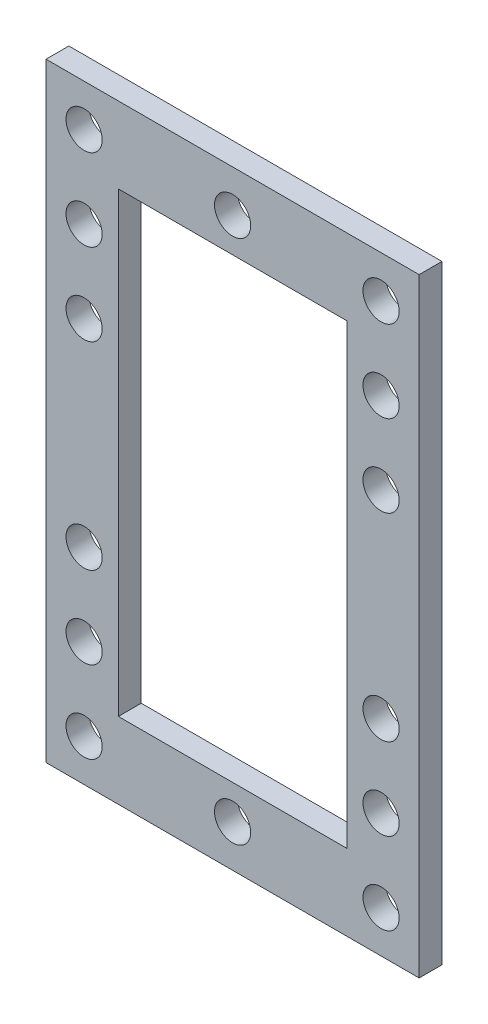
ISO-10303-21;
HEADER;
FILE_DESCRIPTION(('STEP AP214'),'2;1');
FILE_NAME('part.step','',(''),(''),'','','');
FILE_SCHEMA(('AUTOMOTIVE_DESIGN { 1 0 10303 214 1 1 1 1 }'));
ENDSEC;
DATA;
#1=APPLICATION_CONTEXT('core data for automotive mechanical design processes');
#2=APPLICATION_PROTOCOL_DEFINITION('international standard','automotive_design',2000,#1);
#3=PRODUCT_CONTEXT('',#1,'mechanical');
#4=PRODUCT('Part','Part','',(#3));
#5=PRODUCT_RELATED_PRODUCT_CATEGORY('part','',(#4));
#6=PRODUCT_DEFINITION_FORMATION('','',#4);
#7=PRODUCT_DEFINITION_CONTEXT('part definition',#1,'design');
#8=PRODUCT_DEFINITION('design','',#6,#7);
#9=PRODUCT_DEFINITION_SHAPE('','',#8);
#10=(LENGTH_UNIT() NAMED_UNIT(*) SI_UNIT(.MILLI.,.METRE.));
#11=(NAMED_UNIT(*) PLANE_ANGLE_UNIT() SI_UNIT($,.RADIAN.));
#12=(NAMED_UNIT(*) SI_UNIT($,.STERADIAN.) SOLID_ANGLE_UNIT());
#13=UNCERTAINTY_MEASURE_WITH_UNIT(LENGTH_MEASURE(1.E-05),#10,'distance_accuracy_value','');
#14=(GEOMETRIC_REPRESENTATION_CONTEXT(3) GLOBAL_UNCERTAINTY_ASSIGNED_CONTEXT((#13)) GLOBAL_UNIT_ASSIGNED_CONTEXT((#10,
#11,#12)) REPRESENTATION_CONTEXT('',''));
#15=CARTESIAN_POINT('',(0.,0.,0.));
#16=DIRECTION('',(0.,0.,1.));
#17=DIRECTION('',(1.,0.,0.));
#18=AXIS2_PLACEMENT_3D('',#15,#16,#17);
#19=CARTESIAN_POINT('',(0.,0.,-1.2));
#20=DIRECTION('',(0.,0.,-1.));
#21=DIRECTION('',(-1.,0.,0.));
#22=AXIS2_PLACEMENT_3D('',#19,#20,#21);
#23=PLANE('',#22);
#24=CARTESIAN_POINT('',(-7.80000000000001,9.5,-1.2));
#25=DIRECTION('',(0.,0.,1.));
#26=DIRECTION('',(-1.,0.,0.));
#27=AXIS2_PLACEMENT_3D('',#24,#25,#26);
#28=CIRCLE('',#27,0.949999999999999);
#29=CARTESIAN_POINT('',(-8.75000000000001,9.5,-1.2));
#30=VERTEX_POINT('',#29);
#31=EDGE_CURVE('E212',#30,#30,#28,.T.);
#32=ORIENTED_EDGE('',*,*,#31,.T.);
#33=EDGE_LOOP('',(#32));
#34=FACE_BOUND('',#33,.T.);
#35=CARTESIAN_POINT('',(7.80000000000001,-5.2,-1.2));
#36=DIRECTION('',(0.,0.,1.));
#37=DIRECTION('',(1.,0.,0.));
#38=AXIS2_PLACEMENT_3D('',#35,#36,#37);
#39=CIRCLE('',#38,0.949999999999999);
#40=CARTESIAN_POINT('',(8.75000000000001,-5.2,-1.2));
#41=VERTEX_POINT('',#40);
#42=EDGE_CURVE('E235',#41,#41,#39,.T.);
#43=ORIENTED_EDGE('',*,*,#42,.T.);
#44=EDGE_LOOP('',(#43));
#45=FACE_BOUND('',#44,.T.);
#46=CARTESIAN_POINT('',(7.80000000000001,-13.8,-1.2));
#47=DIRECTION('',(0.,0.,1.));
#48=DIRECTION('',(1.,0.,0.));
#49=AXIS2_PLACEMENT_3D('',#46,#47,#48);
#50=CIRCLE('',#49,0.949999999999999);
#51=CARTESIAN_POINT('',(8.75000000000001,-13.8,-1.2));
#52=VERTEX_POINT('',#51);
#53=EDGE_CURVE('E245',#52,#52,#50,.T.);
#54=ORIENTED_EDGE('',*,*,#53,.T.);
#55=EDGE_LOOP('',(#54));
#56=FACE_BOUND('',#55,.T.);
#57=CARTESIAN_POINT('',(-7.80000000000001,-9.5,-1.2));
#58=DIRECTION('',(0.,0.,-1.));
#59=DIRECTION('',(-1.,0.,0.));
#60=AXIS2_PLACEMENT_3D('',#57,#58,#59);
#61=CIRCLE('',#60,0.949999999999999);
#62=CARTESIAN_POINT('',(-8.75000000000001,-9.5,-1.2));
#63=VERTEX_POINT('',#62);
#64=EDGE_CURVE('E255',#63,#63,#61,.T.);
#65=ORIENTED_EDGE('',*,*,#64,.F.);
#66=EDGE_LOOP('',(#65));
#67=FACE_BOUND('',#66,.T.);
#68=CARTESIAN_POINT('',(-7.80000000000001,-13.8,-1.2));
#69=DIRECTION('',(0.,0.,-1.));
#70=DIRECTION('',(-1.,0.,0.));
#71=AXIS2_PLACEMENT_3D('',#68,#69,#70);
#72=CIRCLE('',#71,0.949999999999999);
#73=CARTESIAN_POINT('',(-8.75000000000001,-13.8,-1.2));
#74=VERTEX_POINT('',#73);
#75=EDGE_CURVE('E258',#74,#74,#72,.T.);
#76=ORIENTED_EDGE('',*,*,#75,.F.);
#77=EDGE_LOOP('',(#76));
#78=FACE_BOUND('',#77,.T.);
#79=CARTESIAN_POINT('',(0.,-13.8,-1.2));
#80=DIRECTION('',(0.,0.,-1.));
#81=DIRECTION('',(-1.,0.,0.));
#82=AXIS2_PLACEMENT_3D('',#79,#80,#81);
#83=CIRCLE('',#82,0.949999999999999);
#84=CARTESIAN_POINT('',(-0.949999999999999,-13.8,-1.2));
#85=VERTEX_POINT('',#84);
#86=EDGE_CURVE('E262',#85,#85,#83,.T.);
#87=ORIENTED_EDGE('',*,*,#86,.F.);
#88=EDGE_LOOP('',(#87));
#89=FACE_BOUND('',#88,.T.);
#90=CARTESIAN_POINT('',(0.,13.8,-1.2));
#91=DIRECTION('',(0.,0.,-1.));
#92=DIRECTION('',(-1.,0.,0.));
#93=AXIS2_PLACEMENT_3D('',#90,#91,#92);
#94=CIRCLE('',#93,0.95);
#95=CARTESIAN_POINT('',(-0.95,13.8,-1.2));
#96=VERTEX_POINT('',#95);
#97=EDGE_CURVE('E122',#96,#96,#94,.T.);
#98=ORIENTED_EDGE('',*,*,#97,.F.);
#99=EDGE_LOOP('',(#98));
#100=FACE_BOUND('',#99,.T.);
#101=DIRECTION('',(0.,1.,0.));
#102=VECTOR('',#101,1.);
#103=CARTESIAN_POINT('',(6.,-12.,-1.2));
#104=LINE('',#103,#102);
#105=CARTESIAN_POINT('',(6.,-12.,-1.2));
#106=VERTEX_POINT('',#105);
#107=CARTESIAN_POINT('',(6.,12.,-1.2));
#108=VERTEX_POINT('',#107);
#109=EDGE_CURVE('E101',#106,#108,#104,.T.);
#110=ORIENTED_EDGE('',*,*,#109,.T.);
#111=DIRECTION('',(-1.,0.,0.));
#112=VECTOR('',#111,1.);
#113=CARTESIAN_POINT('',(-6.,12.,-1.2));
#114=LINE('',#113,#112);
#115=CARTESIAN_POINT('',(-6.,12.,-1.2));
#116=VERTEX_POINT('',#115);
#117=EDGE_CURVE('E110',#108,#116,#114,.T.);
#118=ORIENTED_EDGE('',*,*,#117,.T.);
#119=DIRECTION('',(0.,-1.,0.));
#120=VECTOR('',#119,1.);
#121=CARTESIAN_POINT('',(-6.,-12.,-1.2));
#122=LINE('',#121,#120);
#123=CARTESIAN_POINT('',(-6.,-12.,-1.2));
#124=VERTEX_POINT('',#123);
#125=EDGE_CURVE('E49',#116,#124,#122,.T.);
#126=ORIENTED_EDGE('',*,*,#125,.T.);
#127=DIRECTION('',(1.,0.,0.));
#128=VECTOR('',#127,1.);
#129=CARTESIAN_POINT('',(-6.,-12.,-1.2));
#130=LINE('',#129,#128);
#131=EDGE_CURVE('E107',#124,#106,#130,.T.);
#132=ORIENTED_EDGE('',*,*,#131,.T.);
#133=EDGE_LOOP('',(#110,#118,#126,#132));
#134=FACE_BOUND('',#133,.T.);
#135=DIRECTION('',(0.,1.,0.));
#136=VECTOR('',#135,1.);
#137=CARTESIAN_POINT('',(9.8,-16.,-1.2));
#138=LINE('',#137,#136);
#139=CARTESIAN_POINT('',(9.8,-16.,-1.2));
#140=VERTEX_POINT('',#139);
#141=CARTESIAN_POINT('',(9.8,16.,-1.2));
#142=VERTEX_POINT('',#141);
#143=EDGE_CURVE('E139',#140,#142,#138,.T.);
#144=ORIENTED_EDGE('',*,*,#143,.F.);
#145=DIRECTION('',(1.,0.,0.));
#146=VECTOR('',#145,1.);
#147=CARTESIAN_POINT('',(-9.80000000000001,-16.,-1.2));
#148=LINE('',#147,#146);
#149=CARTESIAN_POINT('',(-9.80000000000001,-16.,-1.2));
#150=VERTEX_POINT('',#149);
#151=EDGE_CURVE('E149',#150,#140,#148,.T.);
#152=ORIENTED_EDGE('',*,*,#151,.F.);
#153=DIRECTION('',(0.,-1.,0.));
#154=VECTOR('',#153,1.);
#155=CARTESIAN_POINT('',(-9.80000000000001,-16.,-1.2));
#156=LINE('',#155,#154);
#157=CARTESIAN_POINT('',(-9.80000000000001,16.,-1.2));
#158=VERTEX_POINT('',#157);
#159=EDGE_CURVE('E146',#158,#150,#156,.T.);
#160=ORIENTED_EDGE('',*,*,#159,.F.);
#161=DIRECTION('',(-1.,0.,0.));
#162=VECTOR('',#161,1.);
#163=CARTESIAN_POINT('',(-9.80000000000001,16.,-1.2));
#164=LINE('',#163,#162);
#165=EDGE_CURVE('E142',#142,#158,#164,.T.);
#166=ORIENTED_EDGE('',*,*,#165,.F.);
#167=EDGE_LOOP('',(#144,#152,#160,#166));
#168=FACE_BOUND('',#167,.T.);
#169=CARTESIAN_POINT('',(-7.80000000000001,-5.2,-1.2));
#170=DIRECTION('',(0.,0.,-1.));
#171=DIRECTION('',(-1.,0.,0.));
#172=AXIS2_PLACEMENT_3D('',#169,#170,#171);
#173=CIRCLE('',#172,0.949999999999999);
#174=CARTESIAN_POINT('',(-8.75000000000001,-5.2,-1.2));
#175=VERTEX_POINT('',#174);
#176=EDGE_CURVE('E11',#175,#175,#173,.T.);
#177=ORIENTED_EDGE('',*,*,#176,.F.);
#178=EDGE_LOOP('',(#177));
#179=FACE_BOUND('',#178,.T.);
#180=CARTESIAN_POINT('',(7.80000000000001,-9.5,-1.2));
#181=DIRECTION('',(0.,0.,1.));
#182=DIRECTION('',(1.,0.,0.));
#183=AXIS2_PLACEMENT_3D('',#180,#181,#182);
#184=CIRCLE('',#183,0.949999999999999);
#185=CARTESIAN_POINT('',(8.75000000000001,-9.5,-1.2));
#186=VERTEX_POINT('',#185);
#187=EDGE_CURVE('E188',#186,#186,#184,.T.);
#188=ORIENTED_EDGE('',*,*,#187,.T.);
#189=EDGE_LOOP('',(#188));
#190=FACE_BOUND('',#189,.T.);
#191=CARTESIAN_POINT('',(7.80000000000001,13.8,-1.2));
#192=DIRECTION('',(0.,0.,-1.));
#193=DIRECTION('',(1.,0.,0.));
#194=AXIS2_PLACEMENT_3D('',#191,#192,#193);
#195=CIRCLE('',#194,0.949999999999999);
#196=CARTESIAN_POINT('',(8.75000000000001,13.8,-1.2));
#197=VERTEX_POINT('',#196);
#198=EDGE_CURVE('E192',#197,#197,#195,.T.);
#199=ORIENTED_EDGE('',*,*,#198,.F.);
#200=EDGE_LOOP('',(#199));
#201=FACE_BOUND('',#200,.T.);
#202=CARTESIAN_POINT('',(7.80000000000001,9.5,-1.2));
#203=DIRECTION('',(0.,0.,-1.));
#204=DIRECTION('',(1.,0.,0.));
#205=AXIS2_PLACEMENT_3D('',#202,#203,#204);
#206=CIRCLE('',#205,0.949999999999999);
#207=CARTESIAN_POINT('',(8.75000000000001,9.5,-1.2));
#208=VERTEX_POINT('',#207);
#209=EDGE_CURVE('E196',#208,#208,#206,.T.);
#210=ORIENTED_EDGE('',*,*,#209,.F.);
#211=EDGE_LOOP('',(#210));
#212=FACE_BOUND('',#211,.T.);
#213=CARTESIAN_POINT('',(7.80000000000001,5.2,-1.2));
#214=DIRECTION('',(0.,0.,-1.));
#215=DIRECTION('',(1.,0.,0.));
#216=AXIS2_PLACEMENT_3D('',#213,#214,#215);
#217=CIRCLE('',#216,0.949999999999999);
#218=CARTESIAN_POINT('',(8.75000000000001,5.2,-1.2));
#219=VERTEX_POINT('',#218);
#220=EDGE_CURVE('E200',#219,#219,#217,.T.);
#221=ORIENTED_EDGE('',*,*,#220,.F.);
#222=EDGE_LOOP('',(#221));
#223=FACE_BOUND('',#222,.T.);
#224=CARTESIAN_POINT('',(-7.80000000000001,13.8,-1.2));
#225=DIRECTION('',(0.,0.,1.));
#226=DIRECTION('',(-1.,0.,0.));
#227=AXIS2_PLACEMENT_3D('',#224,#225,#226);
#228=CIRCLE('',#227,0.949999999999999);
#229=CARTESIAN_POINT('',(-8.75000000000001,13.8,-1.2));
#230=VERTEX_POINT('',#229);
#231=EDGE_CURVE('E204',#230,#230,#228,.T.);
#232=ORIENTED_EDGE('',*,*,#231,.T.);
#233=EDGE_LOOP('',(#232));
#234=FACE_BOUND('',#233,.T.);
#235=CARTESIAN_POINT('',(-7.80000000000001,5.2,-1.2));
#236=DIRECTION('',(0.,0.,1.));
#237=DIRECTION('',(-1.,0.,0.));
#238=AXIS2_PLACEMENT_3D('',#235,#236,#237);
#239=CIRCLE('',#238,0.949999999999999);
#240=CARTESIAN_POINT('',(-8.75000000000001,5.2,-1.2));
#241=VERTEX_POINT('',#240);
#242=EDGE_CURVE('E207',#241,#241,#239,.T.);
#243=ORIENTED_EDGE('',*,*,#242,.T.);
#244=EDGE_LOOP('',(#243));
#245=FACE_BOUND('',#244,.T.);
#246=ADVANCED_FACE('F34',(#34,#45,#56,#67,#78,#89,#100,#134,#168,#179,#190,#201,#212,#223,#234,
#245),#23,.T.);
#247=CARTESIAN_POINT('',(0.,0.,0.));
#248=DIRECTION('',(0.,0.,-1.));
#249=DIRECTION('',(-1.,0.,0.));
#250=AXIS2_PLACEMENT_3D('',#247,#248,#249);
#251=PLANE('',#250);
#252=CARTESIAN_POINT('',(-7.80000000000001,9.5,0.));
#253=DIRECTION('',(0.,0.,1.));
#254=DIRECTION('',(-1.,0.,0.));
#255=AXIS2_PLACEMENT_3D('',#252,#253,#254);
#256=CIRCLE('',#255,0.949999999999999);
#257=CARTESIAN_POINT('',(-8.75000000000001,9.5,0.));
#258=VERTEX_POINT('',#257);
#259=EDGE_CURVE('E215',#258,#258,#256,.T.);
#260=ORIENTED_EDGE('',*,*,#259,.F.);
#261=EDGE_LOOP('',(#260));
#262=FACE_BOUND('',#261,.T.);
#263=CARTESIAN_POINT('',(7.80000000000001,-5.2,0.));
#264=DIRECTION('',(0.,0.,1.));
#265=DIRECTION('',(1.,0.,0.));
#266=AXIS2_PLACEMENT_3D('',#263,#264,#265);
#267=CIRCLE('',#266,0.949999999999999);
#268=CARTESIAN_POINT('',(8.75000000000001,-5.2,0.));
#269=VERTEX_POINT('',#268);
#270=EDGE_CURVE('E237',#269,#269,#267,.T.);
#271=ORIENTED_EDGE('',*,*,#270,.F.);
#272=EDGE_LOOP('',(#271));
#273=FACE_BOUND('',#272,.T.);
#274=CARTESIAN_POINT('',(7.80000000000001,-13.8,0.));
#275=DIRECTION('',(0.,0.,1.));
#276=DIRECTION('',(1.,0.,0.));
#277=AXIS2_PLACEMENT_3D('',#274,#275,#276);
#278=CIRCLE('',#277,0.949999999999999);
#279=CARTESIAN_POINT('',(8.75000000000001,-13.8,0.));
#280=VERTEX_POINT('',#279);
#281=EDGE_CURVE('E247',#280,#280,#278,.T.);
#282=ORIENTED_EDGE('',*,*,#281,.F.);
#283=EDGE_LOOP('',(#282));
#284=FACE_BOUND('',#283,.T.);
#285=CARTESIAN_POINT('',(-7.80000000000001,-9.5,0.));
#286=DIRECTION('',(0.,0.,-1.));
#287=DIRECTION('',(-1.,0.,0.));
#288=AXIS2_PLACEMENT_3D('',#285,#286,#287);
#289=CIRCLE('',#288,0.949999999999999);
#290=CARTESIAN_POINT('',(-8.75000000000001,-9.5,0.));
#291=VERTEX_POINT('',#290);
#292=EDGE_CURVE('E250',#291,#291,#289,.T.);
#293=ORIENTED_EDGE('',*,*,#292,.T.);
#294=EDGE_LOOP('',(#293));
#295=FACE_BOUND('',#294,.T.);
#296=CARTESIAN_POINT('',(-7.80000000000001,-13.8,0.));
#297=DIRECTION('',(0.,0.,-1.));
#298=DIRECTION('',(-1.,0.,0.));
#299=AXIS2_PLACEMENT_3D('',#296,#297,#298);
#300=CIRCLE('',#299,0.949999999999999);
#301=CARTESIAN_POINT('',(-8.75000000000001,-13.8,0.));
#302=VERTEX_POINT('',#301);
#303=EDGE_CURVE('E259',#302,#302,#300,.T.);
#304=ORIENTED_EDGE('',*,*,#303,.T.);
#305=EDGE_LOOP('',(#304));
#306=FACE_BOUND('',#305,.T.);
#307=CARTESIAN_POINT('',(0.,-13.8,0.));
#308=DIRECTION('',(0.,0.,-1.));
#309=DIRECTION('',(-1.,0.,0.));
#310=AXIS2_PLACEMENT_3D('',#307,#308,#309);
#311=CIRCLE('',#310,0.949999999999999);
#312=CARTESIAN_POINT('',(-0.949999999999999,-13.8,0.));
#313=VERTEX_POINT('',#312);
#314=EDGE_CURVE('E265',#313,#313,#311,.T.);
#315=ORIENTED_EDGE('',*,*,#314,.T.);
#316=EDGE_LOOP('',(#315));
#317=FACE_BOUND('',#316,.T.);
#318=CARTESIAN_POINT('',(0.,13.8,0.));
#319=DIRECTION('',(0.,0.,-1.));
#320=DIRECTION('',(-1.,0.,0.));
#321=AXIS2_PLACEMENT_3D('',#318,#319,#320);
#322=CIRCLE('',#321,0.95);
#323=CARTESIAN_POINT('',(-0.95,13.8,0.));
#324=VERTEX_POINT('',#323);
#325=EDGE_CURVE('E129',#324,#324,#322,.T.);
#326=ORIENTED_EDGE('',*,*,#325,.T.);
#327=EDGE_LOOP('',(#326));
#328=FACE_BOUND('',#327,.T.);
#329=DIRECTION('',(-1.,0.,0.));
#330=VECTOR('',#329,1.);
#331=CARTESIAN_POINT('',(-6.,12.,0.));
#332=LINE('',#331,#330);
#333=CARTESIAN_POINT('',(6.,12.,0.));
#334=VERTEX_POINT('',#333);
#335=CARTESIAN_POINT('',(-6.,12.,0.));
#336=VERTEX_POINT('',#335);
#337=EDGE_CURVE('E128',#334,#336,#332,.T.);
#338=ORIENTED_EDGE('',*,*,#337,.F.);
#339=DIRECTION('',(0.,1.,0.));
#340=VECTOR('',#339,1.);
#341=CARTESIAN_POINT('',(6.,-12.,0.));
#342=LINE('',#341,#340);
#343=CARTESIAN_POINT('',(6.,-12.,0.));
#344=VERTEX_POINT('',#343);
#345=EDGE_CURVE('E57',#344,#334,#342,.T.);
#346=ORIENTED_EDGE('',*,*,#345,.F.);
#347=DIRECTION('',(1.,0.,0.));
#348=VECTOR('',#347,1.);
#349=CARTESIAN_POINT('',(-6.,-12.,0.));
#350=LINE('',#349,#348);
#351=CARTESIAN_POINT('',(-6.,-12.,0.));
#352=VERTEX_POINT('',#351);
#353=EDGE_CURVE('E116',#352,#344,#350,.T.);
#354=ORIENTED_EDGE('',*,*,#353,.F.);
#355=DIRECTION('',(0.,-1.,0.));
#356=VECTOR('',#355,1.);
#357=CARTESIAN_POINT('',(-6.,-12.,0.));
#358=LINE('',#357,#356);
#359=EDGE_CURVE('E119',#336,#352,#358,.T.);
#360=ORIENTED_EDGE('',*,*,#359,.F.);
#361=EDGE_LOOP('',(#338,#346,#354,#360));
#362=FACE_BOUND('',#361,.T.);
#363=DIRECTION('',(0.,1.,0.));
#364=VECTOR('',#363,1.);
#365=CARTESIAN_POINT('',(9.8,-16.,0.));
#366=LINE('',#365,#364);
#367=CARTESIAN_POINT('',(9.8,-16.,0.));
#368=VERTEX_POINT('',#367);
#369=CARTESIAN_POINT('',(9.8,16.,0.));
#370=VERTEX_POINT('',#369);
#371=EDGE_CURVE('E135',#368,#370,#366,.T.);
#372=ORIENTED_EDGE('',*,*,#371,.T.);
#373=DIRECTION('',(-1.,0.,0.));
#374=VECTOR('',#373,1.);
#375=CARTESIAN_POINT('',(-9.80000000000001,16.,0.));
#376=LINE('',#375,#374);
#377=CARTESIAN_POINT('',(-9.80000000000001,16.,0.));
#378=VERTEX_POINT('',#377);
#379=EDGE_CURVE('E155',#370,#378,#376,.T.);
#380=ORIENTED_EDGE('',*,*,#379,.T.);
#381=DIRECTION('',(0.,-1.,0.));
#382=VECTOR('',#381,1.);
#383=CARTESIAN_POINT('',(-9.80000000000001,-16.,0.));
#384=LINE('',#383,#382);
#385=CARTESIAN_POINT('',(-9.80000000000001,-16.,0.));
#386=VERTEX_POINT('',#385);
#387=EDGE_CURVE('E158',#378,#386,#384,.T.);
#388=ORIENTED_EDGE('',*,*,#387,.T.);
#389=DIRECTION('',(1.,0.,0.));
#390=VECTOR('',#389,1.);
#391=CARTESIAN_POINT('',(-9.80000000000001,-16.,0.));
#392=LINE('',#391,#390);
#393=EDGE_CURVE('E143',#386,#368,#392,.T.);
#394=ORIENTED_EDGE('',*,*,#393,.T.);
#395=EDGE_LOOP('',(#372,#380,#388,#394));
#396=FACE_BOUND('',#395,.T.);
#397=CARTESIAN_POINT('',(-7.80000000000001,-5.2,0.));
#398=DIRECTION('',(0.,0.,-1.));
#399=DIRECTION('',(-1.,0.,0.));
#400=AXIS2_PLACEMENT_3D('',#397,#398,#399);
#401=CIRCLE('',#400,0.949999999999999);
#402=CARTESIAN_POINT('',(-8.75000000000001,-5.2,0.));
#403=VERTEX_POINT('',#402);
#404=EDGE_CURVE('E42',#403,#403,#401,.T.);
#405=ORIENTED_EDGE('',*,*,#404,.T.);
#406=EDGE_LOOP('',(#405));
#407=FACE_BOUND('',#406,.T.);
#408=CARTESIAN_POINT('',(7.80000000000001,-9.5,0.));
#409=DIRECTION('',(0.,0.,1.));
#410=DIRECTION('',(1.,0.,0.));
#411=AXIS2_PLACEMENT_3D('',#408,#409,#410);
#412=CIRCLE('',#411,0.949999999999999);
#413=CARTESIAN_POINT('',(8.75000000000001,-9.5,0.));
#414=VERTEX_POINT('',#413);
#415=EDGE_CURVE('E242',#414,#414,#412,.T.);
#416=ORIENTED_EDGE('',*,*,#415,.F.);
#417=EDGE_LOOP('',(#416));
#418=FACE_BOUND('',#417,.T.);
#419=CARTESIAN_POINT('',(7.80000000000001,13.8,0.));
#420=DIRECTION('',(0.,0.,-1.));
#421=DIRECTION('',(1.,0.,0.));
#422=AXIS2_PLACEMENT_3D('',#419,#420,#421);
#423=CIRCLE('',#422,0.949999999999999);
#424=CARTESIAN_POINT('',(8.75000000000001,13.8,0.));
#425=VERTEX_POINT('',#424);
#426=EDGE_CURVE('E232',#425,#425,#423,.T.);
#427=ORIENTED_EDGE('',*,*,#426,.T.);
#428=EDGE_LOOP('',(#427));
#429=FACE_BOUND('',#428,.T.);
#430=CARTESIAN_POINT('',(7.80000000000001,9.5,0.));
#431=DIRECTION('',(0.,0.,-1.));
#432=DIRECTION('',(1.,0.,0.));
#433=AXIS2_PLACEMENT_3D('',#430,#431,#432);
#434=CIRCLE('',#433,0.949999999999999);
#435=CARTESIAN_POINT('',(8.75000000000001,9.5,0.));
#436=VERTEX_POINT('',#435);
#437=EDGE_CURVE('E228',#436,#436,#434,.T.);
#438=ORIENTED_EDGE('',*,*,#437,.T.);
#439=EDGE_LOOP('',(#438));
#440=FACE_BOUND('',#439,.T.);
#441=CARTESIAN_POINT('',(7.80000000000001,5.2,0.));
#442=DIRECTION('',(0.,0.,-1.));
#443=DIRECTION('',(1.,0.,0.));
#444=AXIS2_PLACEMENT_3D('',#441,#442,#443);
#445=CIRCLE('',#444,0.949999999999999);
#446=CARTESIAN_POINT('',(8.75000000000001,5.2,0.));
#447=VERTEX_POINT('',#446);
#448=EDGE_CURVE('E224',#447,#447,#445,.T.);
#449=ORIENTED_EDGE('',*,*,#448,.T.);
#450=EDGE_LOOP('',(#449));
#451=FACE_BOUND('',#450,.T.);
#452=CARTESIAN_POINT('',(-7.80000000000001,13.8,0.));
#453=DIRECTION('',(0.,0.,1.));
#454=DIRECTION('',(-1.,0.,0.));
#455=AXIS2_PLACEMENT_3D('',#452,#453,#454);
#456=CIRCLE('',#455,0.949999999999999);
#457=CARTESIAN_POINT('',(-8.75000000000001,13.8,0.));
#458=VERTEX_POINT('',#457);
#459=EDGE_CURVE('E220',#458,#458,#456,.T.);
#460=ORIENTED_EDGE('',*,*,#459,.F.);
#461=EDGE_LOOP('',(#460));
#462=FACE_BOUND('',#461,.T.);
#463=CARTESIAN_POINT('',(-7.80000000000001,5.2,0.));
#464=DIRECTION('',(0.,0.,1.));
#465=DIRECTION('',(-1.,0.,0.));
#466=AXIS2_PLACEMENT_3D('',#463,#464,#465);
#467=CIRCLE('',#466,0.949999999999999);
#468=CARTESIAN_POINT('',(-8.75000000000001,5.2,0.));
#469=VERTEX_POINT('',#468);
#470=EDGE_CURVE('E209',#469,#469,#467,.T.);
#471=ORIENTED_EDGE('',*,*,#470,.F.);
#472=EDGE_LOOP('',(#471));
#473=FACE_BOUND('',#472,.T.);
#474=ADVANCED_FACE('F172',(#262,#273,#284,#295,#306,#317,#328,#362,#396,#407,#418,#429,#440,
#451,#462,#473),#251,.F.);
#475=CARTESIAN_POINT('',(9.8,-16.,-1.2));
#476=DIRECTION('',(1.,0.,0.));
#477=DIRECTION('',(0.,0.,-1.));
#478=AXIS2_PLACEMENT_3D('',#475,#476,#477);
#479=PLANE('',#478);
#480=ORIENTED_EDGE('',*,*,#371,.F.);
#481=DIRECTION('',(0.,0.,1.));
#482=VECTOR('',#481,1.);
#483=CARTESIAN_POINT('',(9.8,-16.,-1.2));
#484=LINE('',#483,#482);
#485=EDGE_CURVE('E163',#140,#368,#484,.T.);
#486=ORIENTED_EDGE('',*,*,#485,.F.);
#487=ORIENTED_EDGE('',*,*,#143,.T.);
#488=DIRECTION('',(0.,0.,1.));
#489=VECTOR('',#488,1.);
#490=CARTESIAN_POINT('',(9.8,16.,-1.2));
#491=LINE('',#490,#489);
#492=EDGE_CURVE('E152',#142,#370,#491,.T.);
#493=ORIENTED_EDGE('',*,*,#492,.T.);
#494=EDGE_LOOP('',(#480,#486,#487,#493));
#495=FACE_BOUND('',#494,.T.);
#496=ADVANCED_FACE('F303',(#495),#479,.T.);
#497=CARTESIAN_POINT('',(-9.80000000000001,-16.,-1.2));
#498=DIRECTION('',(0.,-1.,0.));
#499=DIRECTION('',(0.,0.,-1.));
#500=AXIS2_PLACEMENT_3D('',#497,#498,#499);
#501=PLANE('',#500);
#502=ORIENTED_EDGE('',*,*,#393,.F.);
#503=DIRECTION('',(0.,0.,1.));
#504=VECTOR('',#503,1.);
#505=CARTESIAN_POINT('',(-9.80000000000001,-16.,-1.2));
#506=LINE('',#505,#504);
#507=EDGE_CURVE('E165',#150,#386,#506,.T.);
#508=ORIENTED_EDGE('',*,*,#507,.F.);
#509=ORIENTED_EDGE('',*,*,#151,.T.);
#510=ORIENTED_EDGE('',*,*,#485,.T.);
#511=EDGE_LOOP('',(#502,#508,#509,#510));
#512=FACE_BOUND('',#511,.T.);
#513=ADVANCED_FACE('F305',(#512),#501,.T.);
#514=CARTESIAN_POINT('',(-9.80000000000001,-16.,-1.2));
#515=DIRECTION('',(-1.,0.,0.));
#516=DIRECTION('',(0.,0.,1.));
#517=AXIS2_PLACEMENT_3D('',#514,#515,#516);
#518=PLANE('',#517);
#519=ORIENTED_EDGE('',*,*,#387,.F.);
#520=DIRECTION('',(0.,0.,1.));
#521=VECTOR('',#520,1.);
#522=CARTESIAN_POINT('',(-9.80000000000001,16.,-1.2));
#523=LINE('',#522,#521);
#524=EDGE_CURVE('E167',#158,#378,#523,.T.);
#525=ORIENTED_EDGE('',*,*,#524,.F.);
#526=ORIENTED_EDGE('',*,*,#159,.T.);
#527=ORIENTED_EDGE('',*,*,#507,.T.);
#528=EDGE_LOOP('',(#519,#525,#526,#527));
#529=FACE_BOUND('',#528,.T.);
#530=ADVANCED_FACE('F308',(#529),#518,.T.);
#531=CARTESIAN_POINT('',(-9.80000000000001,16.,-1.2));
#532=DIRECTION('',(0.,1.,0.));
#533=DIRECTION('',(0.,0.,1.));
#534=AXIS2_PLACEMENT_3D('',#531,#532,#533);
#535=PLANE('',#534);
#536=ORIENTED_EDGE('',*,*,#379,.F.);
#537=ORIENTED_EDGE('',*,*,#492,.F.);
#538=ORIENTED_EDGE('',*,*,#165,.T.);
#539=ORIENTED_EDGE('',*,*,#524,.T.);
#540=EDGE_LOOP('',(#536,#537,#538,#539));
#541=FACE_BOUND('',#540,.T.);
#542=ADVANCED_FACE('F299',(#541),#535,.T.);
#543=CARTESIAN_POINT('',(6.,-12.,-1.2));
#544=DIRECTION('',(1.,0.,0.));
#545=DIRECTION('',(0.,0.,-1.));
#546=AXIS2_PLACEMENT_3D('',#543,#544,#545);
#547=PLANE('',#546);
#548=ORIENTED_EDGE('',*,*,#345,.T.);
#549=DIRECTION('',(0.,0.,1.));
#550=VECTOR('',#549,1.);
#551=CARTESIAN_POINT('',(6.,12.,-1.2));
#552=LINE('',#551,#550);
#553=EDGE_CURVE('E97',#108,#334,#552,.T.);
#554=ORIENTED_EDGE('',*,*,#553,.F.);
#555=ORIENTED_EDGE('',*,*,#109,.F.);
#556=DIRECTION('',(0.,0.,1.));
#557=VECTOR('',#556,1.);
#558=CARTESIAN_POINT('',(6.,-12.,-1.2));
#559=LINE('',#558,#557);
#560=EDGE_CURVE('E133',#106,#344,#559,.T.);
#561=ORIENTED_EDGE('',*,*,#560,.T.);
#562=EDGE_LOOP('',(#548,#554,#555,#561));
#563=FACE_BOUND('',#562,.T.);
#564=ADVANCED_FACE('F99',(#563),#547,.F.);
#565=CARTESIAN_POINT('',(-6.,-12.,-1.2));
#566=DIRECTION('',(0.,-1.,0.));
#567=DIRECTION('',(0.,0.,-1.));
#568=AXIS2_PLACEMENT_3D('',#565,#566,#567);
#569=PLANE('',#568);
#570=ORIENTED_EDGE('',*,*,#353,.T.);
#571=ORIENTED_EDGE('',*,*,#560,.F.);
#572=ORIENTED_EDGE('',*,*,#131,.F.);
#573=DIRECTION('',(0.,0.,1.));
#574=VECTOR('',#573,1.);
#575=CARTESIAN_POINT('',(-6.,-12.,-1.2));
#576=LINE('',#575,#574);
#577=EDGE_CURVE('E136',#124,#352,#576,.T.);
#578=ORIENTED_EDGE('',*,*,#577,.T.);
#579=EDGE_LOOP('',(#570,#571,#572,#578));
#580=FACE_BOUND('',#579,.T.);
#581=ADVANCED_FACE('F292',(#580),#569,.F.);
#582=CARTESIAN_POINT('',(-6.,-12.,-1.2));
#583=DIRECTION('',(-1.,0.,0.));
#584=DIRECTION('',(0.,0.,1.));
#585=AXIS2_PLACEMENT_3D('',#582,#583,#584);
#586=PLANE('',#585);
#587=ORIENTED_EDGE('',*,*,#359,.T.);
#588=ORIENTED_EDGE('',*,*,#577,.F.);
#589=ORIENTED_EDGE('',*,*,#125,.F.);
#590=DIRECTION('',(0.,0.,1.));
#591=VECTOR('',#590,1.);
#592=CARTESIAN_POINT('',(-6.,12.,-1.2));
#593=LINE('',#592,#591);
#594=EDGE_CURVE('E106',#116,#336,#593,.T.);
#595=ORIENTED_EDGE('',*,*,#594,.T.);
#596=EDGE_LOOP('',(#587,#588,#589,#595));
#597=FACE_BOUND('',#596,.T.);
#598=ADVANCED_FACE('F288',(#597),#586,.F.);
#599=CARTESIAN_POINT('',(-6.,12.,-1.2));
#600=DIRECTION('',(0.,1.,0.));
#601=DIRECTION('',(0.,0.,1.));
#602=AXIS2_PLACEMENT_3D('',#599,#600,#601);
#603=PLANE('',#602);
#604=ORIENTED_EDGE('',*,*,#337,.T.);
#605=ORIENTED_EDGE('',*,*,#594,.F.);
#606=ORIENTED_EDGE('',*,*,#117,.F.);
#607=ORIENTED_EDGE('',*,*,#553,.T.);
#608=EDGE_LOOP('',(#604,#605,#606,#607));
#609=FACE_BOUND('',#608,.T.);
#610=ADVANCED_FACE('F111',(#609),#603,.F.);
#611=CARTESIAN_POINT('',(0.,13.8,0.));
#612=DIRECTION('',(0.,0.,-1.));
#613=DIRECTION('',(-1.,0.,0.));
#614=AXIS2_PLACEMENT_3D('',#611,#612,#613);
#615=CYLINDRICAL_SURFACE('',#614,0.95);
#616=ORIENTED_EDGE('',*,*,#325,.F.);
#617=EDGE_LOOP('',(#616));
#618=FACE_BOUND('',#617,.T.);
#619=ORIENTED_EDGE('',*,*,#97,.T.);
#620=EDGE_LOOP('',(#619));
#621=FACE_BOUND('',#620,.T.);
#622=ADVANCED_FACE('F275',(#618,#621),#615,.F.);
#623=CARTESIAN_POINT('',(0.,-13.8,0.));
#624=DIRECTION('',(0.,0.,-1.));
#625=DIRECTION('',(-1.,0.,0.));
#626=AXIS2_PLACEMENT_3D('',#623,#624,#625);
#627=CYLINDRICAL_SURFACE('',#626,0.949999999999999);
#628=ORIENTED_EDGE('',*,*,#314,.F.);
#629=EDGE_LOOP('',(#628));
#630=FACE_BOUND('',#629,.T.);
#631=ORIENTED_EDGE('',*,*,#86,.T.);
#632=EDGE_LOOP('',(#631));
#633=FACE_BOUND('',#632,.T.);
#634=ADVANCED_FACE('F278',(#630,#633),#627,.F.);
#635=CARTESIAN_POINT('',(-7.80000000000001,-13.8,0.));
#636=DIRECTION('',(0.,0.,-1.));
#637=DIRECTION('',(-1.,0.,0.));
#638=AXIS2_PLACEMENT_3D('',#635,#636,#637);
#639=CYLINDRICAL_SURFACE('',#638,0.949999999999999);
#640=ORIENTED_EDGE('',*,*,#303,.F.);
#641=EDGE_LOOP('',(#640));
#642=FACE_BOUND('',#641,.T.);
#643=ORIENTED_EDGE('',*,*,#75,.T.);
#644=EDGE_LOOP('',(#643));
#645=FACE_BOUND('',#644,.T.);
#646=ADVANCED_FACE('F285',(#642,#645),#639,.F.);
#647=CARTESIAN_POINT('',(-7.80000000000001,-9.5,0.));
#648=DIRECTION('',(0.,0.,-1.));
#649=DIRECTION('',(-1.,0.,0.));
#650=AXIS2_PLACEMENT_3D('',#647,#648,#649);
#651=CYLINDRICAL_SURFACE('',#650,0.949999999999999);
#652=ORIENTED_EDGE('',*,*,#292,.F.);
#653=EDGE_LOOP('',(#652));
#654=FACE_BOUND('',#653,.T.);
#655=ORIENTED_EDGE('',*,*,#64,.T.);
#656=EDGE_LOOP('',(#655));
#657=FACE_BOUND('',#656,.T.);
#658=ADVANCED_FACE('F178',(#654,#657),#651,.F.);
#659=CARTESIAN_POINT('',(-7.80000000000001,-5.2,0.));
#660=DIRECTION('',(0.,0.,-1.));
#661=DIRECTION('',(-1.,0.,0.));
#662=AXIS2_PLACEMENT_3D('',#659,#660,#661);
#663=CYLINDRICAL_SURFACE('',#662,0.949999999999999);
#664=ORIENTED_EDGE('',*,*,#404,.F.);
#665=EDGE_LOOP('',(#664));
#666=FACE_BOUND('',#665,.T.);
#667=ORIENTED_EDGE('',*,*,#176,.T.);
#668=EDGE_LOOP('',(#667));
#669=FACE_BOUND('',#668,.T.);
#670=ADVANCED_FACE('F36',(#666,#669),#663,.F.);
#671=CARTESIAN_POINT('',(7.80000000000001,-13.8,0.));
#672=DIRECTION('',(0.,0.,-1.));
#673=DIRECTION('',(-1.,0.,0.));
#674=AXIS2_PLACEMENT_3D('',#671,#672,#673);
#675=CYLINDRICAL_SURFACE('',#674,0.949999999999999);
#676=ORIENTED_EDGE('',*,*,#281,.T.);
#677=EDGE_LOOP('',(#676));
#678=FACE_BOUND('',#677,.T.);
#679=ORIENTED_EDGE('',*,*,#53,.F.);
#680=EDGE_LOOP('',(#679));
#681=FACE_BOUND('',#680,.T.);
#682=ADVANCED_FACE('F177',(#678,#681),#675,.F.);
#683=CARTESIAN_POINT('',(7.80000000000001,-9.5,0.));
#684=DIRECTION('',(0.,0.,-1.));
#685=DIRECTION('',(-1.,0.,0.));
#686=AXIS2_PLACEMENT_3D('',#683,#684,#685);
#687=CYLINDRICAL_SURFACE('',#686,0.949999999999999);
#688=ORIENTED_EDGE('',*,*,#415,.T.);
#689=EDGE_LOOP('',(#688));
#690=FACE_BOUND('',#689,.T.);
#691=ORIENTED_EDGE('',*,*,#187,.F.);
#692=EDGE_LOOP('',(#691));
#693=FACE_BOUND('',#692,.T.);
#694=ADVANCED_FACE('F401',(#690,#693),#687,.F.);
#695=CARTESIAN_POINT('',(7.80000000000001,-5.2,0.));
#696=DIRECTION('',(0.,0.,-1.));
#697=DIRECTION('',(-1.,0.,0.));
#698=AXIS2_PLACEMENT_3D('',#695,#696,#697);
#699=CYLINDRICAL_SURFACE('',#698,0.949999999999999);
#700=ORIENTED_EDGE('',*,*,#270,.T.);
#701=EDGE_LOOP('',(#700));
#702=FACE_BOUND('',#701,.T.);
#703=ORIENTED_EDGE('',*,*,#42,.F.);
#704=EDGE_LOOP('',(#703));
#705=FACE_BOUND('',#704,.T.);
#706=ADVANCED_FACE('F411',(#702,#705),#699,.F.);
#707=CARTESIAN_POINT('',(7.80000000000001,13.8,0.));
#708=DIRECTION('',(0.,0.,-1.));
#709=DIRECTION('',(-1.,0.,0.));
#710=AXIS2_PLACEMENT_3D('',#707,#708,#709);
#711=CYLINDRICAL_SURFACE('',#710,0.949999999999999);
#712=ORIENTED_EDGE('',*,*,#426,.F.);
#713=EDGE_LOOP('',(#712));
#714=FACE_BOUND('',#713,.T.);
#715=ORIENTED_EDGE('',*,*,#198,.T.);
#716=EDGE_LOOP('',(#715));
#717=FACE_BOUND('',#716,.T.);
#718=ADVANCED_FACE('F421',(#714,#717),#711,.F.);
#719=CARTESIAN_POINT('',(7.80000000000001,9.5,0.));
#720=DIRECTION('',(0.,0.,-1.));
#721=DIRECTION('',(-1.,0.,0.));
#722=AXIS2_PLACEMENT_3D('',#719,#720,#721);
#723=CYLINDRICAL_SURFACE('',#722,0.949999999999999);
#724=ORIENTED_EDGE('',*,*,#437,.F.);
#725=EDGE_LOOP('',(#724));
#726=FACE_BOUND('',#725,.T.);
#727=ORIENTED_EDGE('',*,*,#209,.T.);
#728=EDGE_LOOP('',(#727));
#729=FACE_BOUND('',#728,.T.);
#730=ADVANCED_FACE('F443',(#726,#729),#723,.F.);
#731=CARTESIAN_POINT('',(7.80000000000001,5.2,0.));
#732=DIRECTION('',(0.,0.,-1.));
#733=DIRECTION('',(-1.,0.,0.));
#734=AXIS2_PLACEMENT_3D('',#731,#732,#733);
#735=CYLINDRICAL_SURFACE('',#734,0.949999999999999);
#736=ORIENTED_EDGE('',*,*,#448,.F.);
#737=EDGE_LOOP('',(#736));
#738=FACE_BOUND('',#737,.T.);
#739=ORIENTED_EDGE('',*,*,#220,.T.);
#740=EDGE_LOOP('',(#739));
#741=FACE_BOUND('',#740,.T.);
#742=ADVANCED_FACE('F453',(#738,#741),#735,.F.);
#743=CARTESIAN_POINT('',(-7.80000000000001,13.8,0.));
#744=DIRECTION('',(0.,0.,-1.));
#745=DIRECTION('',(-1.,0.,0.));
#746=AXIS2_PLACEMENT_3D('',#743,#744,#745);
#747=CYLINDRICAL_SURFACE('',#746,0.949999999999999);
#748=ORIENTED_EDGE('',*,*,#459,.T.);
#749=EDGE_LOOP('',(#748));
#750=FACE_BOUND('',#749,.T.);
#751=ORIENTED_EDGE('',*,*,#231,.F.);
#752=EDGE_LOOP('',(#751));
#753=FACE_BOUND('',#752,.T.);
#754=ADVANCED_FACE('F463',(#750,#753),#747,.F.);
#755=CARTESIAN_POINT('',(-7.80000000000001,9.5,0.));
#756=DIRECTION('',(0.,0.,-1.));
#757=DIRECTION('',(-1.,0.,0.));
#758=AXIS2_PLACEMENT_3D('',#755,#756,#757);
#759=CYLINDRICAL_SURFACE('',#758,0.949999999999999);
#760=ORIENTED_EDGE('',*,*,#259,.T.);
#761=EDGE_LOOP('',(#760));
#762=FACE_BOUND('',#761,.T.);
#763=ORIENTED_EDGE('',*,*,#31,.F.);
#764=EDGE_LOOP('',(#763));
#765=FACE_BOUND('',#764,.T.);
#766=ADVANCED_FACE('F473',(#762,#765),#759,.F.);
#767=CARTESIAN_POINT('',(-7.80000000000001,5.2,0.));
#768=DIRECTION('',(0.,0.,-1.));
#769=DIRECTION('',(-1.,0.,0.));
#770=AXIS2_PLACEMENT_3D('',#767,#768,#769);
#771=CYLINDRICAL_SURFACE('',#770,0.949999999999999);
#772=ORIENTED_EDGE('',*,*,#470,.T.);
#773=EDGE_LOOP('',(#772));
#774=FACE_BOUND('',#773,.T.);
#775=ORIENTED_EDGE('',*,*,#242,.F.);
#776=EDGE_LOOP('',(#775));
#777=FACE_BOUND('',#776,.T.);
#778=ADVANCED_FACE('F483',(#774,#777),#771,.F.);
#779=CLOSED_SHELL('',(#246,#474,#496,#513,#530,#542,#564,#581,#598,#610,#622,#634,#646,#658,
#670,#682,#694,#706,#718,#730,#742,#754,#766,#778));
#780=MANIFOLD_SOLID_BREP('B2',#779);
#781=ADVANCED_BREP_SHAPE_REPRESENTATION('',(#18,#780),#14);
#782=SHAPE_DEFINITION_REPRESENTATION(#9,#781);
ENDSEC;
END-ISO-10303-21;
